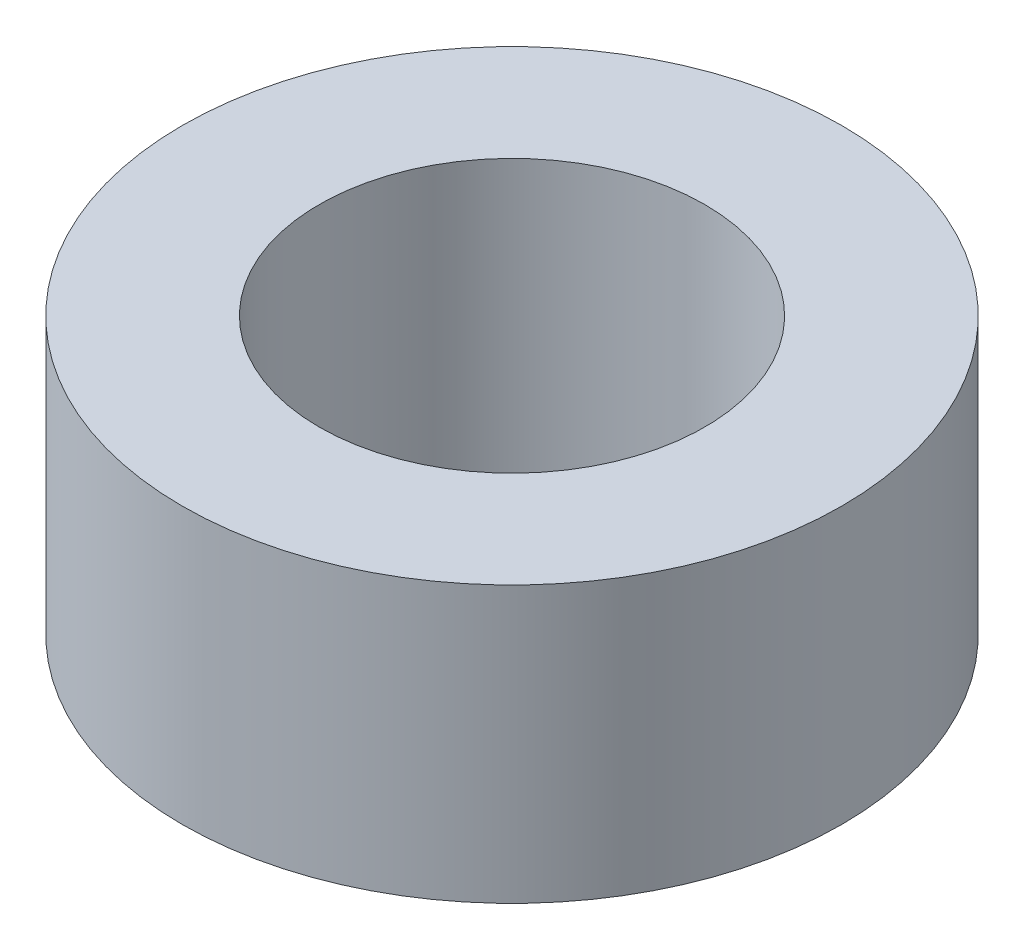
ISO-10303-21;
HEADER;
FILE_DESCRIPTION(('STEP AP214'),'2;1');
FILE_NAME('part.step','',(''),(''),'','','');
FILE_SCHEMA(('AUTOMOTIVE_DESIGN { 1 0 10303 214 1 1 1 1 }'));
ENDSEC;
DATA;
#1=APPLICATION_CONTEXT('core data for automotive mechanical design processes');
#2=APPLICATION_PROTOCOL_DEFINITION('international standard','automotive_design',2000,#1);
#3=PRODUCT_CONTEXT('',#1,'mechanical');
#4=PRODUCT('Part','Part','',(#3));
#5=PRODUCT_RELATED_PRODUCT_CATEGORY('part','',(#4));
#6=PRODUCT_DEFINITION_FORMATION('','',#4);
#7=PRODUCT_DEFINITION_CONTEXT('part definition',#1,'design');
#8=PRODUCT_DEFINITION('design','',#6,#7);
#9=PRODUCT_DEFINITION_SHAPE('','',#8);
#10=(LENGTH_UNIT() NAMED_UNIT(*) SI_UNIT(.MILLI.,.METRE.));
#11=(NAMED_UNIT(*) PLANE_ANGLE_UNIT() SI_UNIT($,.RADIAN.));
#12=(NAMED_UNIT(*) SI_UNIT($,.STERADIAN.) SOLID_ANGLE_UNIT());
#13=UNCERTAINTY_MEASURE_WITH_UNIT(LENGTH_MEASURE(1.E-05),#10,'distance_accuracy_value','');
#14=(GEOMETRIC_REPRESENTATION_CONTEXT(3) GLOBAL_UNCERTAINTY_ASSIGNED_CONTEXT((#13)) GLOBAL_UNIT_ASSIGNED_CONTEXT((#10,
#11,#12)) REPRESENTATION_CONTEXT('',''));
#15=CARTESIAN_POINT('',(0.,0.,0.));
#16=DIRECTION('',(0.,0.,1.));
#17=DIRECTION('',(1.,0.,0.));
#18=AXIS2_PLACEMENT_3D('',#15,#16,#17);
#19=CARTESIAN_POINT('',(0.,2.3,0.));
#20=DIRECTION('',(0.,1.,0.));
#21=DIRECTION('',(0.,0.,1.));
#22=AXIS2_PLACEMENT_3D('',#19,#20,#21);
#23=PLANE('',#22);
#24=CARTESIAN_POINT('',(0.,2.3,0.));
#25=DIRECTION('',(0.,1.,0.));
#26=DIRECTION('',(0.,0.,1.));
#27=AXIS2_PLACEMENT_3D('',#24,#25,#26);
#28=CIRCLE('',#27,2.75);
#29=CARTESIAN_POINT('',(0.,2.3,2.75));
#30=VERTEX_POINT('',#29);
#31=EDGE_CURVE('E10',#30,#30,#28,.T.);
#32=ORIENTED_EDGE('',*,*,#31,.T.);
#33=EDGE_LOOP('',(#32));
#34=FACE_BOUND('',#33,.T.);
#35=CARTESIAN_POINT('',(0.,2.3,0.));
#36=DIRECTION('',(0.,1.,0.));
#37=DIRECTION('',(0.,0.,1.));
#38=AXIS2_PLACEMENT_3D('',#35,#36,#37);
#39=CIRCLE('',#38,1.608);
#40=CARTESIAN_POINT('',(0.,2.3,1.608));
#41=VERTEX_POINT('',#40);
#42=EDGE_CURVE('E39',#41,#41,#39,.T.);
#43=ORIENTED_EDGE('',*,*,#42,.F.);
#44=EDGE_LOOP('',(#43));
#45=FACE_BOUND('',#44,.T.);
#46=ADVANCED_FACE('F28',(#34,#45),#23,.T.);
#47=CARTESIAN_POINT('',(0.,0.,0.));
#48=DIRECTION('',(0.,1.,0.));
#49=DIRECTION('',(0.,0.,1.));
#50=AXIS2_PLACEMENT_3D('',#47,#48,#49);
#51=PLANE('',#50);
#52=CARTESIAN_POINT('',(0.,0.,0.));
#53=DIRECTION('',(0.,1.,0.));
#54=DIRECTION('',(0.,0.,1.));
#55=AXIS2_PLACEMENT_3D('',#52,#53,#54);
#56=CIRCLE('',#55,2.75);
#57=CARTESIAN_POINT('',(0.,0.,2.75));
#58=VERTEX_POINT('',#57);
#59=EDGE_CURVE('E32',#58,#58,#56,.T.);
#60=ORIENTED_EDGE('',*,*,#59,.F.);
#61=EDGE_LOOP('',(#60));
#62=FACE_BOUND('',#61,.T.);
#63=CARTESIAN_POINT('',(0.,0.,0.));
#64=DIRECTION('',(0.,1.,0.));
#65=DIRECTION('',(0.,0.,1.));
#66=AXIS2_PLACEMENT_3D('',#63,#64,#65);
#67=CIRCLE('',#66,1.608);
#68=CARTESIAN_POINT('',(0.,0.,1.608));
#69=VERTEX_POINT('',#68);
#70=EDGE_CURVE('E41',#69,#69,#67,.T.);
#71=ORIENTED_EDGE('',*,*,#70,.T.);
#72=EDGE_LOOP('',(#71));
#73=FACE_BOUND('',#72,.T.);
#74=ADVANCED_FACE('F51',(#62,#73),#51,.F.);
#75=CARTESIAN_POINT('',(0.,2.3,0.));
#76=DIRECTION('',(0.,-1.,0.));
#77=DIRECTION('',(0.,0.,-1.));
#78=AXIS2_PLACEMENT_3D('',#75,#76,#77);
#79=CYLINDRICAL_SURFACE('',#78,2.75);
#80=ORIENTED_EDGE('',*,*,#31,.F.);
#81=EDGE_LOOP('',(#80));
#82=FACE_BOUND('',#81,.T.);
#83=ORIENTED_EDGE('',*,*,#59,.T.);
#84=EDGE_LOOP('',(#83));
#85=FACE_BOUND('',#84,.T.);
#86=ADVANCED_FACE('F30',(#82,#85),#79,.T.);
#87=CARTESIAN_POINT('',(0.,2.3,0.));
#88=DIRECTION('',(0.,-1.,0.));
#89=DIRECTION('',(0.,0.,-1.));
#90=AXIS2_PLACEMENT_3D('',#87,#88,#89);
#91=CYLINDRICAL_SURFACE('',#90,1.608);
#92=ORIENTED_EDGE('',*,*,#42,.T.);
#93=EDGE_LOOP('',(#92));
#94=FACE_BOUND('',#93,.T.);
#95=ORIENTED_EDGE('',*,*,#70,.F.);
#96=EDGE_LOOP('',(#95));
#97=FACE_BOUND('',#96,.T.);
#98=ADVANCED_FACE('F47',(#94,#97),#91,.F.);
#99=CLOSED_SHELL('',(#46,#74,#86,#98));
#100=MANIFOLD_SOLID_BREP('B2',#99);
#101=ADVANCED_BREP_SHAPE_REPRESENTATION('',(#18,#100),#14);
#102=SHAPE_DEFINITION_REPRESENTATION(#9,#101);
ENDSEC;
END-ISO-10303-21;
